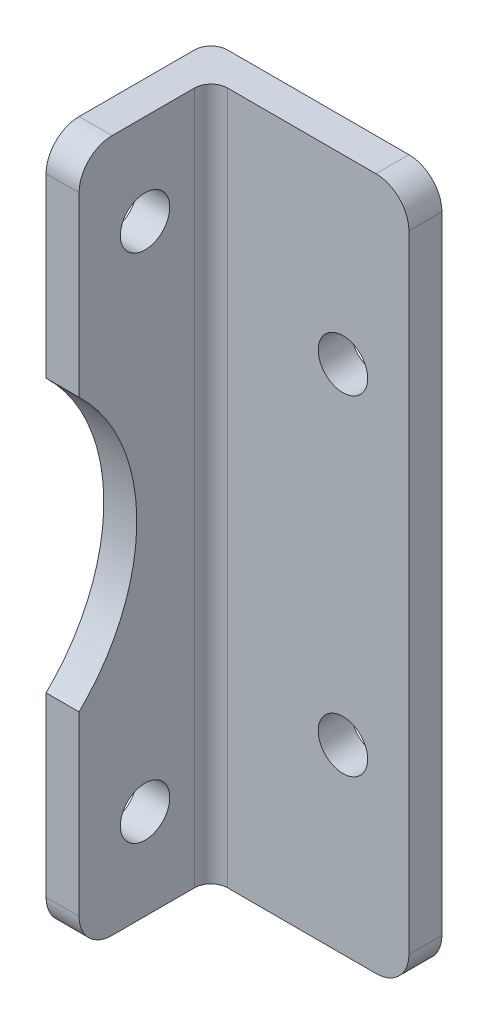
ISO-10303-21;
HEADER;
FILE_DESCRIPTION(('STEP AP214'),'2;1');
FILE_NAME('part.step','',(''),(''),'','','');
FILE_SCHEMA(('AUTOMOTIVE_DESIGN { 1 0 10303 214 1 1 1 1 }'));
ENDSEC;
DATA;
#1=APPLICATION_CONTEXT('core data for automotive mechanical design processes');
#2=APPLICATION_PROTOCOL_DEFINITION('international standard','automotive_design',2000,#1);
#3=PRODUCT_CONTEXT('',#1,'mechanical');
#4=PRODUCT('Part','Part','',(#3));
#5=PRODUCT_RELATED_PRODUCT_CATEGORY('part','',(#4));
#6=PRODUCT_DEFINITION_FORMATION('','',#4);
#7=PRODUCT_DEFINITION_CONTEXT('part definition',#1,'design');
#8=PRODUCT_DEFINITION('design','',#6,#7);
#9=PRODUCT_DEFINITION_SHAPE('','',#8);
#10=(LENGTH_UNIT() NAMED_UNIT(*) SI_UNIT(.MILLI.,.METRE.));
#11=(NAMED_UNIT(*) PLANE_ANGLE_UNIT() SI_UNIT($,.RADIAN.));
#12=(NAMED_UNIT(*) SI_UNIT($,.STERADIAN.) SOLID_ANGLE_UNIT());
#13=UNCERTAINTY_MEASURE_WITH_UNIT(LENGTH_MEASURE(1.E-05),#10,'distance_accuracy_value','');
#14=(GEOMETRIC_REPRESENTATION_CONTEXT(3) GLOBAL_UNCERTAINTY_ASSIGNED_CONTEXT((#13)) GLOBAL_UNIT_ASSIGNED_CONTEXT((#10,
#11,#12)) REPRESENTATION_CONTEXT('',''));
#15=CARTESIAN_POINT('',(0.,0.,0.));
#16=DIRECTION('',(0.,0.,1.));
#17=DIRECTION('',(1.,0.,0.));
#18=AXIS2_PLACEMENT_3D('',#15,#16,#17);
#19=CARTESIAN_POINT('',(4.49048625792812,0.,2.));
#20=DIRECTION('',(1.,0.,0.));
#21=DIRECTION('',(0.,0.,-1.));
#22=AXIS2_PLACEMENT_3D('',#19,#20,#21);
#23=PLANE('',#22);
#24=DIRECTION('',(0.,-1.,0.));
#25=VECTOR('',#24,1.);
#26=CARTESIAN_POINT('',(4.49048625792812,0.,0.));
#27=LINE('',#26,#25);
#28=CARTESIAN_POINT('',(4.49048625792812,10.0866807610994,0.));
#29=VERTEX_POINT('',#28);
#30=CARTESIAN_POINT('',(4.49048625792812,-27.9133192389006,0.));
#31=VERTEX_POINT('',#30);
#32=EDGE_CURVE('E210',#29,#31,#27,.T.);
#33=ORIENTED_EDGE('',*,*,#32,.F.);
#34=DIRECTION('',(0.,0.,-1.));
#35=VECTOR('',#34,1.);
#36=CARTESIAN_POINT('',(4.49048625792812,10.0866807610994,2.));
#37=LINE('',#36,#35);
#38=CARTESIAN_POINT('',(4.49048625792812,10.0866807610994,2.));
#39=VERTEX_POINT('',#38);
#40=EDGE_CURVE('E253',#29,#39,#37,.F.);
#41=ORIENTED_EDGE('',*,*,#40,.T.);
#42=DIRECTION('',(0.,-1.,0.));
#43=VECTOR('',#42,1.);
#44=CARTESIAN_POINT('',(4.49048625792812,0.,2.));
#45=LINE('',#44,#43);
#46=CARTESIAN_POINT('',(4.49048625792812,-27.9133192389006,2.));
#47=VERTEX_POINT('',#46);
#48=EDGE_CURVE('E197',#39,#47,#45,.T.);
#49=ORIENTED_EDGE('',*,*,#48,.T.);
#50=DIRECTION('',(0.,0.,-1.));
#51=VECTOR('',#50,1.);
#52=CARTESIAN_POINT('',(4.49048625792812,-27.9133192389006,0.));
#53=LINE('',#52,#51);
#54=EDGE_CURVE('E250',#47,#31,#53,.T.);
#55=ORIENTED_EDGE('',*,*,#54,.T.);
#56=EDGE_LOOP('',(#33,#41,#49,#55));
#57=FACE_BOUND('',#56,.T.);
#58=ADVANCED_FACE('F39',(#57),#23,.T.);
#59=CARTESIAN_POINT('',(0.,12.0866807610994,2.));
#60=DIRECTION('',(0.,1.,0.));
#61=DIRECTION('',(-1.,0.,0.));
#62=AXIS2_PLACEMENT_3D('',#59,#60,#61);
#63=PLANE('',#62);
#64=DIRECTION('',(1.,0.,0.));
#65=VECTOR('',#64,1.);
#66=CARTESIAN_POINT('',(0.,12.0866807610994,0.));
#67=LINE('',#66,#65);
#68=CARTESIAN_POINT('',(-8.50951374207188,12.0866807610994,0.));
#69=VERTEX_POINT('',#68);
#70=CARTESIAN_POINT('',(2.49048625792812,12.0866807610994,0.));
#71=VERTEX_POINT('',#70);
#72=EDGE_CURVE('E213',#69,#71,#67,.T.);
#73=ORIENTED_EDGE('',*,*,#72,.F.);
#74=CARTESIAN_POINT('',(-8.50951374207188,12.0866807610994,1.));
#75=DIRECTION('',(0.,1.,0.));
#76=DIRECTION('',(-1.,0.,0.));
#77=AXIS2_PLACEMENT_3D('',#74,#75,#76);
#78=CIRCLE('',#77,1.);
#79=CARTESIAN_POINT('',(-9.50951374207188,12.0866807610994,1.));
#80=VERTEX_POINT('',#79);
#81=EDGE_CURVE('E267',#69,#80,#78,.T.);
#82=ORIENTED_EDGE('',*,*,#81,.T.);
#83=DIRECTION('',(0.,0.,-1.));
#84=VECTOR('',#83,1.);
#85=CARTESIAN_POINT('',(-9.50951374207188,12.0866807610994,2.));
#86=LINE('',#85,#84);
#87=CARTESIAN_POINT('',(-9.50951374207188,12.0866807610994,8.));
#88=VERTEX_POINT('',#87);
#89=EDGE_CURVE('E218',#88,#80,#86,.T.);
#90=ORIENTED_EDGE('',*,*,#89,.F.);
#91=DIRECTION('',(-1.,0.,0.));
#92=VECTOR('',#91,1.);
#93=CARTESIAN_POINT('',(-7.50951374207188,12.0866807610994,8.));
#94=LINE('',#93,#92);
#95=CARTESIAN_POINT('',(-7.50951374207188,12.0866807610994,8.));
#96=VERTEX_POINT('',#95);
#97=EDGE_CURVE('E230',#88,#96,#94,.F.);
#98=ORIENTED_EDGE('',*,*,#97,.T.);
#99=DIRECTION('',(0.,0.,1.));
#100=VECTOR('',#99,1.);
#101=CARTESIAN_POINT('',(-7.50951374207188,12.0866807610994,0.));
#102=LINE('',#101,#100);
#103=CARTESIAN_POINT('',(-7.50951374207188,12.0866807610994,3.));
#104=VERTEX_POINT('',#103);
#105=EDGE_CURVE('E152',#104,#96,#102,.T.);
#106=ORIENTED_EDGE('',*,*,#105,.F.);
#107=CARTESIAN_POINT('',(-6.50951374207188,12.0866807610994,3.));
#108=DIRECTION('',(0.,1.,0.));
#109=DIRECTION('',(-1.,0.,0.));
#110=AXIS2_PLACEMENT_3D('',#107,#108,#109);
#111=CIRCLE('',#110,1.);
#112=CARTESIAN_POINT('',(-6.50951374207188,12.0866807610994,2.));
#113=VERTEX_POINT('',#112);
#114=EDGE_CURVE('E47',#104,#113,#111,.F.);
#115=ORIENTED_EDGE('',*,*,#114,.T.);
#116=DIRECTION('',(1.,0.,0.));
#117=VECTOR('',#116,1.);
#118=CARTESIAN_POINT('',(0.,12.0866807610994,2.));
#119=LINE('',#118,#117);
#120=CARTESIAN_POINT('',(2.49048625792812,12.0866807610994,2.));
#121=VERTEX_POINT('',#120);
#122=EDGE_CURVE('E200',#113,#121,#119,.T.);
#123=ORIENTED_EDGE('',*,*,#122,.T.);
#124=DIRECTION('',(0.,0.,-1.));
#125=VECTOR('',#124,1.);
#126=CARTESIAN_POINT('',(2.49048625792812,12.0866807610994,2.));
#127=LINE('',#126,#125);
#128=EDGE_CURVE('E227',#121,#71,#127,.T.);
#129=ORIENTED_EDGE('',*,*,#128,.T.);
#130=EDGE_LOOP('',(#73,#82,#90,#98,#106,#115,#123,#129));
#131=FACE_BOUND('',#130,.T.);
#132=ADVANCED_FACE('F282',(#131),#63,.T.);
#133=CARTESIAN_POINT('',(-9.50951374207188,0.,2.));
#134=DIRECTION('',(1.,0.,0.));
#135=DIRECTION('',(0.,0.,-1.));
#136=AXIS2_PLACEMENT_3D('',#133,#134,#135);
#137=PLANE('',#136);
#138=ORIENTED_EDGE('',*,*,#89,.T.);
#139=DIRECTION('',(0.,-1.,0.));
#140=VECTOR('',#139,1.);
#141=CARTESIAN_POINT('',(-9.50951374207188,0.,1.));
#142=LINE('',#141,#140);
#143=CARTESIAN_POINT('',(-9.50951374207188,-29.9133192389006,1.));
#144=VERTEX_POINT('',#143);
#145=EDGE_CURVE('E260',#80,#144,#142,.T.);
#146=ORIENTED_EDGE('',*,*,#145,.T.);
#147=DIRECTION('',(0.,0.,-1.));
#148=VECTOR('',#147,1.);
#149=CARTESIAN_POINT('',(-9.50951374207188,-29.9133192389006,2.));
#150=LINE('',#149,#148);
#151=CARTESIAN_POINT('',(-9.50951374207188,-29.9133192389006,8.00000000000001));
#152=VERTEX_POINT('',#151);
#153=EDGE_CURVE('E204',#152,#144,#150,.T.);
#154=ORIENTED_EDGE('',*,*,#153,.F.);
#155=CARTESIAN_POINT('',(-9.50951374207188,-27.9133192389006,8.00000000000001));
#156=DIRECTION('',(1.,0.,0.));
#157=DIRECTION('',(0.,0.,-1.));
#158=AXIS2_PLACEMENT_3D('',#155,#156,#157);
#159=CIRCLE('',#158,2.);
#160=CARTESIAN_POINT('',(-9.50951374207188,-27.9133192389006,10.));
#161=VERTEX_POINT('',#160);
#162=EDGE_CURVE('E223',#152,#161,#159,.F.);
#163=ORIENTED_EDGE('',*,*,#162,.T.);
#164=DIRECTION('',(0.,-1.,0.));
#165=VECTOR('',#164,1.);
#166=CARTESIAN_POINT('',(-9.50951374207188,0.,10.));
#167=LINE('',#166,#165);
#168=CARTESIAN_POINT('',(-9.50951374207188,-17.1746750598298,10.));
#169=VERTEX_POINT('',#168);
#170=EDGE_CURVE('E185',#169,#161,#167,.T.);
#171=ORIENTED_EDGE('',*,*,#170,.F.);
#172=CARTESIAN_POINT('',(-9.50951374207188,-8.91331923890064,18.));
#173=DIRECTION('',(-1.,0.,0.));
#174=DIRECTION('',(0.,0.,1.));
#175=AXIS2_PLACEMENT_3D('',#172,#173,#174);
#176=CIRCLE('',#175,11.5);
#177=CARTESIAN_POINT('',(-9.50951374207188,-0.651963417971482,10.));
#178=VERTEX_POINT('',#177);
#179=EDGE_CURVE('E182',#178,#169,#176,.T.);
#180=ORIENTED_EDGE('',*,*,#179,.F.);
#181=CARTESIAN_POINT('',(-9.50951374207188,10.0866807610994,10.));
#182=VERTEX_POINT('',#181);
#183=EDGE_CURVE('E159',#182,#178,#167,.T.);
#184=ORIENTED_EDGE('',*,*,#183,.F.);
#185=CARTESIAN_POINT('',(-9.50951374207188,10.0866807610994,8.));
#186=DIRECTION('',(1.,0.,0.));
#187=DIRECTION('',(0.,0.,-1.));
#188=AXIS2_PLACEMENT_3D('',#185,#186,#187);
#189=CIRCLE('',#188,2.);
#190=EDGE_CURVE('E225',#182,#88,#189,.F.);
#191=ORIENTED_EDGE('',*,*,#190,.T.);
#192=EDGE_LOOP('',(#138,#146,#154,#163,#171,#180,#184,#191));
#193=FACE_BOUND('',#192,.T.);
#194=CARTESIAN_POINT('',(-9.50951374207188,-24.4133192389006,6.));
#195=DIRECTION('',(-1.,0.,0.));
#196=DIRECTION('',(0.,0.,1.));
#197=AXIS2_PLACEMENT_3D('',#194,#195,#196);
#198=CIRCLE('',#197,1.5);
#199=CARTESIAN_POINT('',(-9.50951374207188,-24.4133192389006,7.5));
#200=VERTEX_POINT('',#199);
#201=EDGE_CURVE('E179',#200,#200,#198,.T.);
#202=ORIENTED_EDGE('',*,*,#201,.F.);
#203=EDGE_LOOP('',(#202));
#204=FACE_BOUND('',#203,.T.);
#205=CARTESIAN_POINT('',(-9.50951374207188,6.58668076109936,6.));
#206=DIRECTION('',(-1.,0.,0.));
#207=DIRECTION('',(0.,0.,1.));
#208=AXIS2_PLACEMENT_3D('',#205,#206,#207);
#209=CIRCLE('',#208,1.5);
#210=CARTESIAN_POINT('',(-9.50951374207188,6.58668076109936,7.5));
#211=VERTEX_POINT('',#210);
#212=EDGE_CURVE('E171',#211,#211,#209,.T.);
#213=ORIENTED_EDGE('',*,*,#212,.F.);
#214=EDGE_LOOP('',(#213));
#215=FACE_BOUND('',#214,.T.);
#216=ADVANCED_FACE('F288',(#193,#204,#215),#137,.F.);
#217=CARTESIAN_POINT('',(0.49048625792812,1.08668076109936,2.));
#218=DIRECTION('',(0.,0.,-1.));
#219=DIRECTION('',(-1.,0.,0.));
#220=AXIS2_PLACEMENT_3D('',#217,#218,#219);
#221=CYLINDRICAL_SURFACE('',#220,1.5);
#222=CARTESIAN_POINT('',(0.49048625792812,1.08668076109936,2.));
#223=DIRECTION('',(0.,0.,1.));
#224=DIRECTION('',(1.,0.,0.));
#225=AXIS2_PLACEMENT_3D('',#222,#223,#224);
#226=CIRCLE('',#225,1.5);
#227=CARTESIAN_POINT('',(1.99048625792812,1.08668076109936,2.));
#228=VERTEX_POINT('',#227);
#229=EDGE_CURVE('E193',#228,#228,#226,.T.);
#230=ORIENTED_EDGE('',*,*,#229,.T.);
#231=EDGE_LOOP('',(#230));
#232=FACE_BOUND('',#231,.T.);
#233=CARTESIAN_POINT('',(0.49048625792812,1.08668076109936,0.));
#234=DIRECTION('',(0.,0.,1.));
#235=DIRECTION('',(1.,0.,0.));
#236=AXIS2_PLACEMENT_3D('',#233,#234,#235);
#237=CIRCLE('',#236,1.5);
#238=CARTESIAN_POINT('',(1.99048625792812,1.08668076109936,0.));
#239=VERTEX_POINT('',#238);
#240=EDGE_CURVE('E207',#239,#239,#237,.T.);
#241=ORIENTED_EDGE('',*,*,#240,.F.);
#242=EDGE_LOOP('',(#241));
#243=FACE_BOUND('',#242,.T.);
#244=ADVANCED_FACE('F335',(#232,#243),#221,.F.);
#245=CARTESIAN_POINT('',(0.49048625792812,-18.9133192389006,2.));
#246=DIRECTION('',(0.,0.,-1.));
#247=DIRECTION('',(-1.,0.,0.));
#248=AXIS2_PLACEMENT_3D('',#245,#246,#247);
#249=CYLINDRICAL_SURFACE('',#248,1.5);
#250=CARTESIAN_POINT('',(0.49048625792812,-18.9133192389006,2.));
#251=DIRECTION('',(0.,0.,1.));
#252=DIRECTION('',(1.,0.,0.));
#253=AXIS2_PLACEMENT_3D('',#250,#251,#252);
#254=CIRCLE('',#253,1.5);
#255=CARTESIAN_POINT('',(1.99048625792812,-18.9133192389006,2.));
#256=VERTEX_POINT('',#255);
#257=EDGE_CURVE('E190',#256,#256,#254,.T.);
#258=ORIENTED_EDGE('',*,*,#257,.T.);
#259=EDGE_LOOP('',(#258));
#260=FACE_BOUND('',#259,.T.);
#261=CARTESIAN_POINT('',(0.49048625792812,-18.9133192389006,0.));
#262=DIRECTION('',(0.,0.,1.));
#263=DIRECTION('',(1.,0.,0.));
#264=AXIS2_PLACEMENT_3D('',#261,#262,#263);
#265=CIRCLE('',#264,1.5);
#266=CARTESIAN_POINT('',(1.99048625792812,-18.9133192389006,0.));
#267=VERTEX_POINT('',#266);
#268=EDGE_CURVE('E188',#267,#267,#265,.T.);
#269=ORIENTED_EDGE('',*,*,#268,.F.);
#270=EDGE_LOOP('',(#269));
#271=FACE_BOUND('',#270,.T.);
#272=ADVANCED_FACE('F338',(#260,#271),#249,.F.);
#273=CARTESIAN_POINT('',(0.,-29.9133192389006,2.));
#274=DIRECTION('',(0.,1.,0.));
#275=DIRECTION('',(0.,0.,1.));
#276=AXIS2_PLACEMENT_3D('',#273,#274,#275);
#277=PLANE('',#276);
#278=ORIENTED_EDGE('',*,*,#153,.T.);
#279=CARTESIAN_POINT('',(-8.50951374207188,-29.9133192389006,1.));
#280=DIRECTION('',(0.,1.,0.));
#281=DIRECTION('',(0.,0.,1.));
#282=AXIS2_PLACEMENT_3D('',#279,#280,#281);
#283=CIRCLE('',#282,1.);
#284=CARTESIAN_POINT('',(-8.50951374207188,-29.9133192389006,0.));
#285=VERTEX_POINT('',#284);
#286=EDGE_CURVE('E263',#144,#285,#283,.F.);
#287=ORIENTED_EDGE('',*,*,#286,.T.);
#288=DIRECTION('',(1.,0.,0.));
#289=VECTOR('',#288,1.);
#290=CARTESIAN_POINT('',(0.,-29.9133192389006,0.));
#291=LINE('',#290,#289);
#292=CARTESIAN_POINT('',(2.49048625792812,-29.9133192389006,0.));
#293=VERTEX_POINT('',#292);
#294=EDGE_CURVE('E194',#285,#293,#291,.T.);
#295=ORIENTED_EDGE('',*,*,#294,.T.);
#296=DIRECTION('',(0.,0.,-1.));
#297=VECTOR('',#296,1.);
#298=CARTESIAN_POINT('',(2.49048625792812,-29.9133192389006,2.));
#299=LINE('',#298,#297);
#300=CARTESIAN_POINT('',(2.49048625792812,-29.9133192389006,2.));
#301=VERTEX_POINT('',#300);
#302=EDGE_CURVE('E237',#293,#301,#299,.F.);
#303=ORIENTED_EDGE('',*,*,#302,.T.);
#304=DIRECTION('',(1.,0.,0.));
#305=VECTOR('',#304,1.);
#306=CARTESIAN_POINT('',(0.,-29.9133192389006,2.));
#307=LINE('',#306,#305);
#308=CARTESIAN_POINT('',(-6.50951374207188,-29.9133192389006,2.));
#309=VERTEX_POINT('',#308);
#310=EDGE_CURVE('E202',#309,#301,#307,.T.);
#311=ORIENTED_EDGE('',*,*,#310,.F.);
#312=CARTESIAN_POINT('',(-6.50951374207188,-29.9133192389006,3.));
#313=DIRECTION('',(0.,1.,0.));
#314=DIRECTION('',(0.,0.,1.));
#315=AXIS2_PLACEMENT_3D('',#312,#313,#314);
#316=CIRCLE('',#315,1.);
#317=CARTESIAN_POINT('',(-7.50951374207188,-29.9133192389006,3.));
#318=VERTEX_POINT('',#317);
#319=EDGE_CURVE('E11',#309,#318,#316,.T.);
#320=ORIENTED_EDGE('',*,*,#319,.T.);
#321=DIRECTION('',(0.,0.,1.));
#322=VECTOR('',#321,1.);
#323=CARTESIAN_POINT('',(-7.50951374207188,-29.9133192389006,0.));
#324=LINE('',#323,#322);
#325=CARTESIAN_POINT('',(-7.50951374207188,-29.9133192389006,8.00000000000001));
#326=VERTEX_POINT('',#325);
#327=EDGE_CURVE('E175',#318,#326,#324,.T.);
#328=ORIENTED_EDGE('',*,*,#327,.T.);
#329=DIRECTION('',(-1.,0.,0.));
#330=VECTOR('',#329,1.);
#331=CARTESIAN_POINT('',(0.,-29.9133192389006,8.00000000000001));
#332=LINE('',#331,#330);
#333=EDGE_CURVE('E240',#326,#152,#332,.T.);
#334=ORIENTED_EDGE('',*,*,#333,.T.);
#335=EDGE_LOOP('',(#278,#287,#295,#303,#311,#320,#328,#334));
#336=FACE_BOUND('',#335,.T.);
#337=ADVANCED_FACE('F278',(#336),#277,.F.);
#338=CARTESIAN_POINT('',(0.,0.,2.));
#339=DIRECTION('',(0.,0.,1.));
#340=DIRECTION('',(1.,0.,0.));
#341=AXIS2_PLACEMENT_3D('',#338,#339,#340);
#342=PLANE('',#341);
#343=ORIENTED_EDGE('',*,*,#122,.F.);
#344=DIRECTION('',(0.,1.,0.));
#345=VECTOR('',#344,1.);
#346=CARTESIAN_POINT('',(-6.50951374207188,0.,2.));
#347=LINE('',#346,#345);
#348=EDGE_CURVE('E271',#113,#309,#347,.F.);
#349=ORIENTED_EDGE('',*,*,#348,.T.);
#350=ORIENTED_EDGE('',*,*,#310,.T.);
#351=CARTESIAN_POINT('',(2.49048625792812,-27.9133192389006,2.));
#352=DIRECTION('',(0.,0.,1.));
#353=DIRECTION('',(1.,0.,0.));
#354=AXIS2_PLACEMENT_3D('',#351,#352,#353);
#355=CIRCLE('',#354,2.);
#356=EDGE_CURVE('E255',#301,#47,#355,.T.);
#357=ORIENTED_EDGE('',*,*,#356,.T.);
#358=ORIENTED_EDGE('',*,*,#48,.F.);
#359=CARTESIAN_POINT('',(2.49048625792812,10.0866807610994,2.));
#360=DIRECTION('',(0.,0.,1.));
#361=DIRECTION('',(1.,0.,0.));
#362=AXIS2_PLACEMENT_3D('',#359,#360,#361);
#363=CIRCLE('',#362,2.);
#364=EDGE_CURVE('E257',#39,#121,#363,.T.);
#365=ORIENTED_EDGE('',*,*,#364,.T.);
#366=EDGE_LOOP('',(#343,#349,#350,#357,#358,#365));
#367=FACE_BOUND('',#366,.T.);
#368=ORIENTED_EDGE('',*,*,#257,.F.);
#369=EDGE_LOOP('',(#368));
#370=FACE_BOUND('',#369,.T.);
#371=ORIENTED_EDGE('',*,*,#229,.F.);
#372=EDGE_LOOP('',(#371));
#373=FACE_BOUND('',#372,.T.);
#374=ADVANCED_FACE('F274',(#367,#370,#373),#342,.T.);
#375=CARTESIAN_POINT('',(0.,0.,0.));
#376=DIRECTION('',(0.,0.,1.));
#377=DIRECTION('',(1.,0.,0.));
#378=AXIS2_PLACEMENT_3D('',#375,#376,#377);
#379=PLANE('',#378);
#380=ORIENTED_EDGE('',*,*,#268,.T.);
#381=EDGE_LOOP('',(#380));
#382=FACE_BOUND('',#381,.T.);
#383=ORIENTED_EDGE('',*,*,#240,.T.);
#384=EDGE_LOOP('',(#383));
#385=FACE_BOUND('',#384,.T.);
#386=ORIENTED_EDGE('',*,*,#294,.F.);
#387=DIRECTION('',(0.,-1.,0.));
#388=VECTOR('',#387,1.);
#389=CARTESIAN_POINT('',(-8.50951374207188,0.,0.));
#390=LINE('',#389,#388);
#391=EDGE_CURVE('E265',#285,#69,#390,.F.);
#392=ORIENTED_EDGE('',*,*,#391,.T.);
#393=ORIENTED_EDGE('',*,*,#72,.T.);
#394=CARTESIAN_POINT('',(2.49048625792812,10.0866807610994,0.));
#395=DIRECTION('',(0.,0.,1.));
#396=DIRECTION('',(1.,0.,0.));
#397=AXIS2_PLACEMENT_3D('',#394,#395,#396);
#398=CIRCLE('',#397,2.);
#399=EDGE_CURVE('E248',#71,#29,#398,.F.);
#400=ORIENTED_EDGE('',*,*,#399,.T.);
#401=ORIENTED_EDGE('',*,*,#32,.T.);
#402=CARTESIAN_POINT('',(2.49048625792812,-27.9133192389006,0.));
#403=DIRECTION('',(0.,0.,1.));
#404=DIRECTION('',(1.,0.,0.));
#405=AXIS2_PLACEMENT_3D('',#402,#403,#404);
#406=CIRCLE('',#405,2.);
#407=EDGE_CURVE('E245',#31,#293,#406,.F.);
#408=ORIENTED_EDGE('',*,*,#407,.T.);
#409=EDGE_LOOP('',(#386,#392,#393,#400,#401,#408));
#410=FACE_BOUND('',#409,.T.);
#411=ADVANCED_FACE('F306',(#382,#385,#410),#379,.F.);
#412=CARTESIAN_POINT('',(-7.50951374207188,-8.91331923890064,18.));
#413=DIRECTION('',(-1.,0.,0.));
#414=DIRECTION('',(0.,0.,1.));
#415=AXIS2_PLACEMENT_3D('',#412,#413,#414);
#416=CYLINDRICAL_SURFACE('',#415,11.5);
#417=ORIENTED_EDGE('',*,*,#179,.T.);
#418=DIRECTION('',(-1.,0.,0.));
#419=VECTOR('',#418,1.);
#420=CARTESIAN_POINT('',(-7.50951374207188,-17.1746750598298,10.));
#421=LINE('',#420,#419);
#422=CARTESIAN_POINT('',(-7.50951374207188,-17.1746750598298,10.));
#423=VERTEX_POINT('',#422);
#424=EDGE_CURVE('E163',#423,#169,#421,.T.);
#425=ORIENTED_EDGE('',*,*,#424,.F.);
#426=CARTESIAN_POINT('',(-7.50951374207188,-8.91331923890064,18.));
#427=DIRECTION('',(-1.,0.,0.));
#428=DIRECTION('',(0.,0.,1.));
#429=AXIS2_PLACEMENT_3D('',#426,#427,#428);
#430=CIRCLE('',#429,11.5);
#431=CARTESIAN_POINT('',(-7.50951374207188,-0.651963417971482,10.));
#432=VERTEX_POINT('',#431);
#433=EDGE_CURVE('E145',#432,#423,#430,.T.);
#434=ORIENTED_EDGE('',*,*,#433,.F.);
#435=DIRECTION('',(-1.,0.,0.));
#436=VECTOR('',#435,1.);
#437=CARTESIAN_POINT('',(-7.50951374207188,-0.651963417971482,10.));
#438=LINE('',#437,#436);
#439=EDGE_CURVE('E156',#432,#178,#438,.T.);
#440=ORIENTED_EDGE('',*,*,#439,.T.);
#441=EDGE_LOOP('',(#417,#425,#434,#440));
#442=FACE_BOUND('',#441,.T.);
#443=ADVANCED_FACE('F166',(#442),#416,.F.);
#444=CARTESIAN_POINT('',(-7.50951374207188,0.,10.));
#445=DIRECTION('',(0.,0.,-1.));
#446=DIRECTION('',(0.,1.,0.));
#447=AXIS2_PLACEMENT_3D('',#444,#445,#446);
#448=PLANE('',#447);
#449=ORIENTED_EDGE('',*,*,#170,.T.);
#450=DIRECTION('',(-1.,0.,0.));
#451=VECTOR('',#450,1.);
#452=CARTESIAN_POINT('',(-7.50951374207188,-27.9133192389006,10.));
#453=LINE('',#452,#451);
#454=CARTESIAN_POINT('',(-7.50951374207188,-27.9133192389006,10.));
#455=VERTEX_POINT('',#454);
#456=EDGE_CURVE('E243',#161,#455,#453,.F.);
#457=ORIENTED_EDGE('',*,*,#456,.T.);
#458=DIRECTION('',(0.,-1.,0.));
#459=VECTOR('',#458,1.);
#460=CARTESIAN_POINT('',(-7.50951374207188,0.,10.));
#461=LINE('',#460,#459);
#462=EDGE_CURVE('E154',#423,#455,#461,.T.);
#463=ORIENTED_EDGE('',*,*,#462,.F.);
#464=ORIENTED_EDGE('',*,*,#424,.T.);
#465=EDGE_LOOP('',(#449,#457,#463,#464));
#466=FACE_BOUND('',#465,.T.);
#467=ADVANCED_FACE('F294',(#466),#448,.F.);
#468=CARTESIAN_POINT('',(-7.50951374207188,10.0866807610994,10.));
#469=VERTEX_POINT('',#468);
#470=EDGE_CURVE('E138',#469,#432,#461,.T.);
#471=ORIENTED_EDGE('',*,*,#470,.F.);
#472=DIRECTION('',(-1.,0.,0.));
#473=VECTOR('',#472,1.);
#474=CARTESIAN_POINT('',(-9.50951374207188,10.0866807610994,10.));
#475=LINE('',#474,#473);
#476=EDGE_CURVE('E221',#469,#182,#475,.T.);
#477=ORIENTED_EDGE('',*,*,#476,.T.);
#478=ORIENTED_EDGE('',*,*,#183,.T.);
#479=ORIENTED_EDGE('',*,*,#439,.F.);
#480=EDGE_LOOP('',(#471,#477,#478,#479));
#481=FACE_BOUND('',#480,.T.);
#482=ADVANCED_FACE('F157',(#481),#448,.F.);
#483=CARTESIAN_POINT('',(-7.50951374207188,-24.4133192389006,6.));
#484=DIRECTION('',(-1.,0.,0.));
#485=DIRECTION('',(0.,0.,1.));
#486=AXIS2_PLACEMENT_3D('',#483,#484,#485);
#487=CYLINDRICAL_SURFACE('',#486,1.5);
#488=CARTESIAN_POINT('',(-7.50951374207188,-24.4133192389006,6.));
#489=DIRECTION('',(-1.,0.,0.));
#490=DIRECTION('',(0.,0.,1.));
#491=AXIS2_PLACEMENT_3D('',#488,#489,#490);
#492=CIRCLE('',#491,1.5);
#493=CARTESIAN_POINT('',(-7.50951374207188,-24.4133192389006,7.5));
#494=VERTEX_POINT('',#493);
#495=EDGE_CURVE('E168',#494,#494,#492,.T.);
#496=ORIENTED_EDGE('',*,*,#495,.F.);
#497=EDGE_LOOP('',(#496));
#498=FACE_BOUND('',#497,.T.);
#499=ORIENTED_EDGE('',*,*,#201,.T.);
#500=EDGE_LOOP('',(#499));
#501=FACE_BOUND('',#500,.T.);
#502=ADVANCED_FACE('F353',(#498,#501),#487,.F.);
#503=CARTESIAN_POINT('',(-7.50951374207188,6.58668076109936,6.));
#504=DIRECTION('',(-1.,0.,0.));
#505=DIRECTION('',(0.,0.,1.));
#506=AXIS2_PLACEMENT_3D('',#503,#504,#505);
#507=CYLINDRICAL_SURFACE('',#506,1.5);
#508=CARTESIAN_POINT('',(-7.50951374207188,6.58668076109936,6.));
#509=DIRECTION('',(-1.,0.,0.));
#510=DIRECTION('',(0.,0.,1.));
#511=AXIS2_PLACEMENT_3D('',#508,#509,#510);
#512=CIRCLE('',#511,1.5);
#513=CARTESIAN_POINT('',(-7.50951374207188,6.58668076109936,7.5));
#514=VERTEX_POINT('',#513);
#515=EDGE_CURVE('E164',#514,#514,#512,.T.);
#516=ORIENTED_EDGE('',*,*,#515,.F.);
#517=EDGE_LOOP('',(#516));
#518=FACE_BOUND('',#517,.T.);
#519=ORIENTED_EDGE('',*,*,#212,.T.);
#520=EDGE_LOOP('',(#519));
#521=FACE_BOUND('',#520,.T.);
#522=ADVANCED_FACE('F347',(#518,#521),#507,.F.);
#523=CARTESIAN_POINT('',(-7.50951374207188,0.,0.));
#524=DIRECTION('',(-1.,0.,0.));
#525=DIRECTION('',(0.,0.,1.));
#526=AXIS2_PLACEMENT_3D('',#523,#524,#525);
#527=PLANE('',#526);
#528=ORIENTED_EDGE('',*,*,#495,.T.);
#529=EDGE_LOOP('',(#528));
#530=FACE_BOUND('',#529,.T.);
#531=ORIENTED_EDGE('',*,*,#327,.F.);
#532=DIRECTION('',(0.,1.,0.));
#533=VECTOR('',#532,1.);
#534=CARTESIAN_POINT('',(-7.50951374207188,0.,3.));
#535=LINE('',#534,#533);
#536=EDGE_CURVE('E269',#318,#104,#535,.T.);
#537=ORIENTED_EDGE('',*,*,#536,.T.);
#538=ORIENTED_EDGE('',*,*,#105,.T.);
#539=CARTESIAN_POINT('',(-7.50951374207188,10.0866807610994,8.));
#540=DIRECTION('',(-1.,0.,0.));
#541=DIRECTION('',(0.,0.,1.));
#542=AXIS2_PLACEMENT_3D('',#539,#540,#541);
#543=CIRCLE('',#542,2.);
#544=EDGE_CURVE('E148',#96,#469,#543,.F.);
#545=ORIENTED_EDGE('',*,*,#544,.T.);
#546=ORIENTED_EDGE('',*,*,#470,.T.);
#547=ORIENTED_EDGE('',*,*,#433,.T.);
#548=ORIENTED_EDGE('',*,*,#462,.T.);
#549=CARTESIAN_POINT('',(-7.50951374207188,-27.9133192389006,8.00000000000001));
#550=DIRECTION('',(-1.,0.,0.));
#551=DIRECTION('',(0.,0.,1.));
#552=AXIS2_PLACEMENT_3D('',#549,#550,#551);
#553=CIRCLE('',#552,2.);
#554=EDGE_CURVE('E233',#455,#326,#553,.F.);
#555=ORIENTED_EDGE('',*,*,#554,.T.);
#556=EDGE_LOOP('',(#531,#537,#538,#545,#546,#547,#548,#555));
#557=FACE_BOUND('',#556,.T.);
#558=ORIENTED_EDGE('',*,*,#515,.T.);
#559=EDGE_LOOP('',(#558));
#560=FACE_BOUND('',#559,.T.);
#561=ADVANCED_FACE('F141',(#530,#557,#560),#527,.F.);
#562=CARTESIAN_POINT('',(-7.50951374207188,10.0866807610994,8.));
#563=DIRECTION('',(1.,0.,0.));
#564=DIRECTION('',(0.,1.,0.));
#565=AXIS2_PLACEMENT_3D('',#562,#563,#564);
#566=CYLINDRICAL_SURFACE('',#565,2.);
#567=ORIENTED_EDGE('',*,*,#544,.F.);
#568=ORIENTED_EDGE('',*,*,#97,.F.);
#569=ORIENTED_EDGE('',*,*,#190,.F.);
#570=ORIENTED_EDGE('',*,*,#476,.F.);
#571=EDGE_LOOP('',(#567,#568,#569,#570));
#572=FACE_BOUND('',#571,.T.);
#573=ADVANCED_FACE('F286',(#572),#566,.T.);
#574=CARTESIAN_POINT('',(0.,-27.9133192389006,8.00000000000001));
#575=DIRECTION('',(-1.,0.,0.));
#576=DIRECTION('',(0.,0.,1.));
#577=AXIS2_PLACEMENT_3D('',#574,#575,#576);
#578=CYLINDRICAL_SURFACE('',#577,2.);
#579=ORIENTED_EDGE('',*,*,#554,.F.);
#580=ORIENTED_EDGE('',*,*,#456,.F.);
#581=ORIENTED_EDGE('',*,*,#162,.F.);
#582=ORIENTED_EDGE('',*,*,#333,.F.);
#583=EDGE_LOOP('',(#579,#580,#581,#582));
#584=FACE_BOUND('',#583,.T.);
#585=ADVANCED_FACE('F298',(#584),#578,.T.);
#586=CARTESIAN_POINT('',(2.49048625792812,10.0866807610994,2.));
#587=DIRECTION('',(0.,0.,-1.));
#588=DIRECTION('',(-1.,0.,0.));
#589=AXIS2_PLACEMENT_3D('',#586,#587,#588);
#590=CYLINDRICAL_SURFACE('',#589,2.);
#591=ORIENTED_EDGE('',*,*,#364,.F.);
#592=ORIENTED_EDGE('',*,*,#40,.F.);
#593=ORIENTED_EDGE('',*,*,#399,.F.);
#594=ORIENTED_EDGE('',*,*,#128,.F.);
#595=EDGE_LOOP('',(#591,#592,#593,#594));
#596=FACE_BOUND('',#595,.T.);
#597=ADVANCED_FACE('F317',(#596),#590,.T.);
#598=CARTESIAN_POINT('',(2.49048625792812,-27.9133192389006,2.));
#599=DIRECTION('',(0.,0.,1.));
#600=DIRECTION('',(1.,0.,0.));
#601=AXIS2_PLACEMENT_3D('',#598,#599,#600);
#602=CYLINDRICAL_SURFACE('',#601,2.);
#603=ORIENTED_EDGE('',*,*,#356,.F.);
#604=ORIENTED_EDGE('',*,*,#302,.F.);
#605=ORIENTED_EDGE('',*,*,#407,.F.);
#606=ORIENTED_EDGE('',*,*,#54,.F.);
#607=EDGE_LOOP('',(#603,#604,#605,#606));
#608=FACE_BOUND('',#607,.T.);
#609=ADVANCED_FACE('F310',(#608),#602,.T.);
#610=CARTESIAN_POINT('',(-8.50951374207188,0.,1.));
#611=DIRECTION('',(0.,-1.,0.));
#612=DIRECTION('',(0.,0.,-1.));
#613=AXIS2_PLACEMENT_3D('',#610,#611,#612);
#614=CYLINDRICAL_SURFACE('',#613,1.);
#615=ORIENTED_EDGE('',*,*,#81,.F.);
#616=ORIENTED_EDGE('',*,*,#391,.F.);
#617=ORIENTED_EDGE('',*,*,#286,.F.);
#618=ORIENTED_EDGE('',*,*,#145,.F.);
#619=EDGE_LOOP('',(#615,#616,#617,#618));
#620=FACE_BOUND('',#619,.T.);
#621=ADVANCED_FACE('F302',(#620),#614,.T.);
#622=CARTESIAN_POINT('',(-6.50951374207188,0.,3.));
#623=DIRECTION('',(0.,1.,0.));
#624=DIRECTION('',(0.,0.,1.));
#625=AXIS2_PLACEMENT_3D('',#622,#623,#624);
#626=CYLINDRICAL_SURFACE('',#625,1.);
#627=ORIENTED_EDGE('',*,*,#319,.F.);
#628=ORIENTED_EDGE('',*,*,#348,.F.);
#629=ORIENTED_EDGE('',*,*,#114,.F.);
#630=ORIENTED_EDGE('',*,*,#536,.F.);
#631=EDGE_LOOP('',(#627,#628,#629,#630));
#632=FACE_BOUND('',#631,.T.);
#633=ADVANCED_FACE('F41',(#632),#626,.F.);
#634=CLOSED_SHELL('',(#58,#132,#216,#244,#272,#337,#374,#411,#443,#467,#482,#502,#522,#561,#573,
#585,#597,#609,#621,#633));
#635=MANIFOLD_SOLID_BREP('B2',#634);
#636=ADVANCED_BREP_SHAPE_REPRESENTATION('',(#18,#635),#14);
#637=SHAPE_DEFINITION_REPRESENTATION(#9,#636);
ENDSEC;
END-ISO-10303-21;
